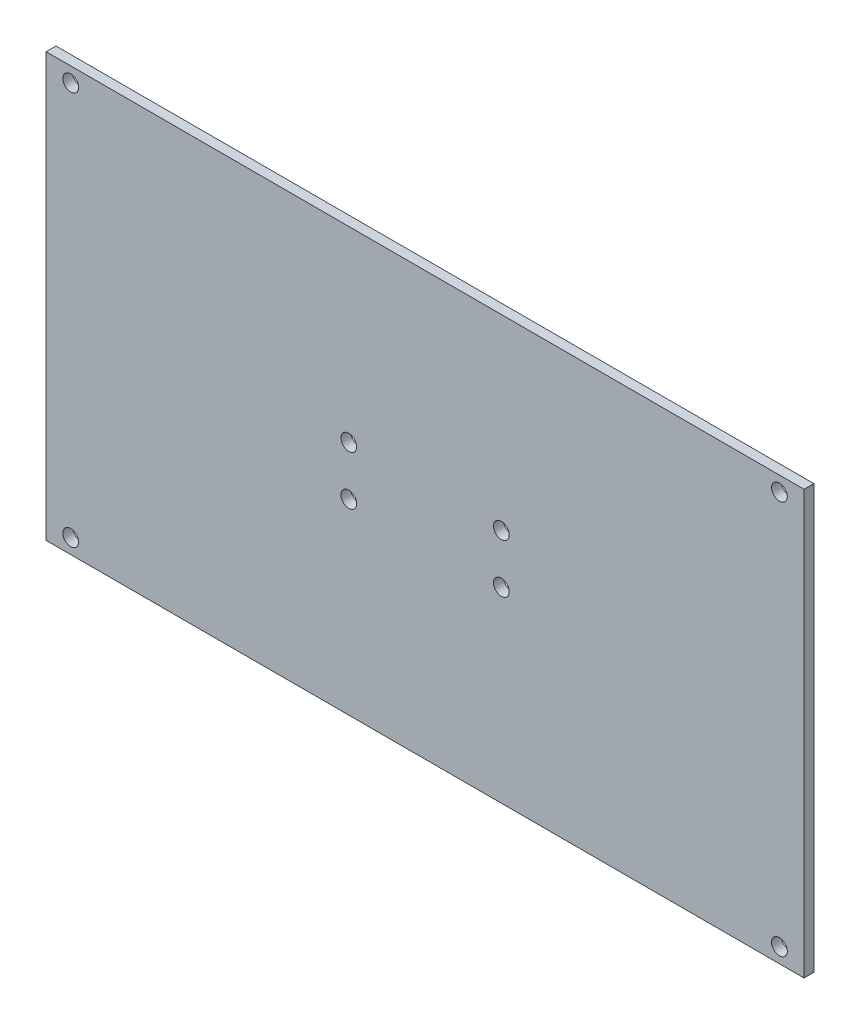
ISO-10303-21;
HEADER;
FILE_DESCRIPTION(('STEP AP214'),'2;1');
FILE_NAME('part.step','',(''),(''),'','','');
FILE_SCHEMA(('AUTOMOTIVE_DESIGN { 1 0 10303 214 1 1 1 1 }'));
ENDSEC;
DATA;
#1=APPLICATION_CONTEXT('core data for automotive mechanical design processes');
#2=APPLICATION_PROTOCOL_DEFINITION('international standard','automotive_design',2000,#1);
#3=PRODUCT_CONTEXT('',#1,'mechanical');
#4=PRODUCT('Part','Part','',(#3));
#5=PRODUCT_RELATED_PRODUCT_CATEGORY('part','',(#4));
#6=PRODUCT_DEFINITION_FORMATION('','',#4);
#7=PRODUCT_DEFINITION_CONTEXT('part definition',#1,'design');
#8=PRODUCT_DEFINITION('design','',#6,#7);
#9=PRODUCT_DEFINITION_SHAPE('','',#8);
#10=(LENGTH_UNIT() NAMED_UNIT(*) SI_UNIT(.MILLI.,.METRE.));
#11=(NAMED_UNIT(*) PLANE_ANGLE_UNIT() SI_UNIT($,.RADIAN.));
#12=(NAMED_UNIT(*) SI_UNIT($,.STERADIAN.) SOLID_ANGLE_UNIT());
#13=UNCERTAINTY_MEASURE_WITH_UNIT(LENGTH_MEASURE(1.E-05),#10,'distance_accuracy_value','');
#14=(GEOMETRIC_REPRESENTATION_CONTEXT(3) GLOBAL_UNCERTAINTY_ASSIGNED_CONTEXT((#13)) GLOBAL_UNIT_ASSIGNED_CONTEXT((#10,
#11,#12)) REPRESENTATION_CONTEXT('',''));
#15=CARTESIAN_POINT('',(0.,0.,0.));
#16=DIRECTION('',(0.,0.,1.));
#17=DIRECTION('',(1.,0.,0.));
#18=AXIS2_PLACEMENT_3D('',#15,#16,#17);
#19=CARTESIAN_POINT('',(0.,0.,2.));
#20=DIRECTION('',(0.,0.,1.));
#21=DIRECTION('',(1.,0.,0.));
#22=AXIS2_PLACEMENT_3D('',#19,#20,#21);
#23=PLANE('',#22);
#24=CARTESIAN_POINT('',(-98.5,38.,2.));
#25=DIRECTION('',(0.,0.,1.));
#26=DIRECTION('',(-1.,0.,0.));
#27=AXIS2_PLACEMENT_3D('',#24,#25,#26);
#28=CIRCLE('',#27,1.60000000000001);
#29=CARTESIAN_POINT('',(-100.1,38.,2.));
#30=VERTEX_POINT('',#29);
#31=EDGE_CURVE('E147',#30,#30,#28,.T.);
#32=ORIENTED_EDGE('',*,*,#31,.F.);
#33=EDGE_LOOP('',(#32));
#34=FACE_BOUND('',#33,.T.);
#35=CARTESIAN_POINT('',(-67.5,38.,2.));
#36=DIRECTION('',(0.,0.,1.));
#37=DIRECTION('',(1.,0.,0.));
#38=AXIS2_PLACEMENT_3D('',#35,#36,#37);
#39=CIRCLE('',#38,1.60000000000001);
#40=CARTESIAN_POINT('',(-65.9,38.,2.));
#41=VERTEX_POINT('',#40);
#42=EDGE_CURVE('E146',#41,#41,#39,.T.);
#43=ORIENTED_EDGE('',*,*,#42,.F.);
#44=EDGE_LOOP('',(#43));
#45=FACE_BOUND('',#44,.T.);
#46=CARTESIAN_POINT('',(-67.5,48.,2.));
#47=DIRECTION('',(0.,0.,1.));
#48=DIRECTION('',(-1.,0.,0.));
#49=AXIS2_PLACEMENT_3D('',#46,#47,#48);
#50=CIRCLE('',#49,1.60000000000001);
#51=CARTESIAN_POINT('',(-69.1,48.,2.));
#52=VERTEX_POINT('',#51);
#53=EDGE_CURVE('E153',#52,#52,#50,.T.);
#54=ORIENTED_EDGE('',*,*,#53,.F.);
#55=EDGE_LOOP('',(#54));
#56=FACE_BOUND('',#55,.T.);
#57=CARTESIAN_POINT('',(-98.5,48.,2.));
#58=DIRECTION('',(0.,0.,1.));
#59=DIRECTION('',(1.,0.,0.));
#60=AXIS2_PLACEMENT_3D('',#57,#58,#59);
#61=CIRCLE('',#60,1.60000000000001);
#62=CARTESIAN_POINT('',(-96.9,48.,2.));
#63=VERTEX_POINT('',#62);
#64=EDGE_CURVE('E139',#63,#63,#61,.T.);
#65=ORIENTED_EDGE('',*,*,#64,.F.);
#66=EDGE_LOOP('',(#65));
#67=FACE_BOUND('',#66,.T.);
#68=CARTESIAN_POINT('',(-11.,83.,2.));
#69=DIRECTION('',(0.,0.,1.));
#70=DIRECTION('',(1.,0.,0.));
#71=AXIS2_PLACEMENT_3D('',#68,#69,#70);
#72=CIRCLE('',#71,1.60000000000002);
#73=CARTESIAN_POINT('',(-9.39999999999998,83.,2.));
#74=VERTEX_POINT('',#73);
#75=EDGE_CURVE('E122',#74,#74,#72,.T.);
#76=ORIENTED_EDGE('',*,*,#75,.F.);
#77=EDGE_LOOP('',(#76));
#78=FACE_BOUND('',#77,.T.);
#79=CARTESIAN_POINT('',(-155.,3.,2.));
#80=DIRECTION('',(0.,0.,1.));
#81=DIRECTION('',(-1.,0.,0.));
#82=AXIS2_PLACEMENT_3D('',#79,#80,#81);
#83=CIRCLE('',#82,1.60000000000002);
#84=CARTESIAN_POINT('',(-156.6,3.,2.));
#85=VERTEX_POINT('',#84);
#86=EDGE_CURVE('E101',#85,#85,#83,.T.);
#87=ORIENTED_EDGE('',*,*,#86,.F.);
#88=EDGE_LOOP('',(#87));
#89=FACE_BOUND('',#88,.T.);
#90=DIRECTION('',(0.,-1.,0.));
#91=VECTOR('',#90,1.);
#92=CARTESIAN_POINT('',(-160.,86.,2.));
#93=LINE('',#92,#91);
#94=CARTESIAN_POINT('',(-160.,86.,2.));
#95=VERTEX_POINT('',#94);
#96=CARTESIAN_POINT('',(-160.,0.,2.));
#97=VERTEX_POINT('',#96);
#98=EDGE_CURVE('E86',#95,#97,#93,.T.);
#99=ORIENTED_EDGE('',*,*,#98,.T.);
#100=DIRECTION('',(1.,0.,0.));
#101=VECTOR('',#100,1.);
#102=CARTESIAN_POINT('',(-160.,0.,2.));
#103=LINE('',#102,#101);
#104=CARTESIAN_POINT('',(-5.99999999999999,0.,2.));
#105=VERTEX_POINT('',#104);
#106=EDGE_CURVE('E81',#97,#105,#103,.T.);
#107=ORIENTED_EDGE('',*,*,#106,.T.);
#108=DIRECTION('',(0.,1.,0.));
#109=VECTOR('',#108,1.);
#110=CARTESIAN_POINT('',(-6.00000000000001,86.,2.));
#111=LINE('',#110,#109);
#112=CARTESIAN_POINT('',(-6.00000000000001,86.,2.));
#113=VERTEX_POINT('',#112);
#114=EDGE_CURVE('E84',#105,#113,#111,.T.);
#115=ORIENTED_EDGE('',*,*,#114,.T.);
#116=DIRECTION('',(-1.,0.,0.));
#117=VECTOR('',#116,1.);
#118=CARTESIAN_POINT('',(-160.,86.,2.));
#119=LINE('',#118,#117);
#120=EDGE_CURVE('E51',#113,#95,#119,.T.);
#121=ORIENTED_EDGE('',*,*,#120,.T.);
#122=EDGE_LOOP('',(#99,#107,#115,#121));
#123=FACE_BOUND('',#122,.T.);
#124=CARTESIAN_POINT('',(-11.,3.,2.));
#125=DIRECTION('',(0.,0.,1.));
#126=DIRECTION('',(1.,0.,0.));
#127=AXIS2_PLACEMENT_3D('',#124,#125,#126);
#128=CIRCLE('',#127,1.6);
#129=CARTESIAN_POINT('',(-9.4,3.,2.));
#130=VERTEX_POINT('',#129);
#131=EDGE_CURVE('E116',#130,#130,#128,.T.);
#132=ORIENTED_EDGE('',*,*,#131,.F.);
#133=EDGE_LOOP('',(#132));
#134=FACE_BOUND('',#133,.T.);
#135=CARTESIAN_POINT('',(-155.,83.,2.));
#136=DIRECTION('',(0.,0.,1.));
#137=DIRECTION('',(1.,0.,0.));
#138=AXIS2_PLACEMENT_3D('',#135,#136,#137);
#139=CIRCLE('',#138,1.60000000000002);
#140=CARTESIAN_POINT('',(-153.4,83.,2.));
#141=VERTEX_POINT('',#140);
#142=EDGE_CURVE('E128',#141,#141,#139,.T.);
#143=ORIENTED_EDGE('',*,*,#142,.F.);
#144=EDGE_LOOP('',(#143));
#145=FACE_BOUND('',#144,.T.);
#146=ADVANCED_FACE('F34',(#34,#45,#56,#67,#78,#89,#123,#134,#145),#23,.T.);
#147=CARTESIAN_POINT('',(0.,0.,0.));
#148=DIRECTION('',(0.,0.,1.));
#149=DIRECTION('',(1.,0.,0.));
#150=AXIS2_PLACEMENT_3D('',#147,#148,#149);
#151=PLANE('',#150);
#152=CARTESIAN_POINT('',(-98.5,38.,0.));
#153=DIRECTION('',(0.,0.,1.));
#154=DIRECTION('',(1.,0.,0.));
#155=AXIS2_PLACEMENT_3D('',#152,#153,#154);
#156=CIRCLE('',#155,1.60000000000001);
#157=CARTESIAN_POINT('',(-96.9,38.,0.));
#158=VERTEX_POINT('',#157);
#159=EDGE_CURVE('E143',#158,#158,#156,.F.);
#160=ORIENTED_EDGE('',*,*,#159,.F.);
#161=EDGE_LOOP('',(#160));
#162=FACE_BOUND('',#161,.T.);
#163=CARTESIAN_POINT('',(-67.5,38.,0.));
#164=DIRECTION('',(0.,0.,1.));
#165=DIRECTION('',(1.,0.,0.));
#166=AXIS2_PLACEMENT_3D('',#163,#164,#165);
#167=CIRCLE('',#166,1.60000000000001);
#168=CARTESIAN_POINT('',(-65.9,38.,0.));
#169=VERTEX_POINT('',#168);
#170=EDGE_CURVE('E150',#169,#169,#167,.F.);
#171=ORIENTED_EDGE('',*,*,#170,.F.);
#172=EDGE_LOOP('',(#171));
#173=FACE_BOUND('',#172,.T.);
#174=CARTESIAN_POINT('',(-67.5,48.,0.));
#175=DIRECTION('',(0.,0.,1.));
#176=DIRECTION('',(1.,0.,0.));
#177=AXIS2_PLACEMENT_3D('',#174,#175,#176);
#178=CIRCLE('',#177,1.60000000000001);
#179=CARTESIAN_POINT('',(-65.9,48.,0.));
#180=VERTEX_POINT('',#179);
#181=EDGE_CURVE('E142',#180,#180,#178,.F.);
#182=ORIENTED_EDGE('',*,*,#181,.F.);
#183=EDGE_LOOP('',(#182));
#184=FACE_BOUND('',#183,.T.);
#185=CARTESIAN_POINT('',(-98.5,48.,0.));
#186=DIRECTION('',(0.,0.,1.));
#187=DIRECTION('',(1.,0.,0.));
#188=AXIS2_PLACEMENT_3D('',#185,#186,#187);
#189=CIRCLE('',#188,1.60000000000001);
#190=CARTESIAN_POINT('',(-96.9,48.,0.));
#191=VERTEX_POINT('',#190);
#192=EDGE_CURVE('E134',#191,#191,#189,.F.);
#193=ORIENTED_EDGE('',*,*,#192,.F.);
#194=EDGE_LOOP('',(#193));
#195=FACE_BOUND('',#194,.T.);
#196=DIRECTION('',(0.,-1.,0.));
#197=VECTOR('',#196,1.);
#198=CARTESIAN_POINT('',(-160.,86.,0.));
#199=LINE('',#198,#197);
#200=CARTESIAN_POINT('',(-160.,86.,0.));
#201=VERTEX_POINT('',#200);
#202=CARTESIAN_POINT('',(-160.,0.,0.));
#203=VERTEX_POINT('',#202);
#204=EDGE_CURVE('E98',#201,#203,#199,.T.);
#205=ORIENTED_EDGE('',*,*,#204,.F.);
#206=DIRECTION('',(-1.,0.,0.));
#207=VECTOR('',#206,1.);
#208=CARTESIAN_POINT('',(-160.,86.,0.));
#209=LINE('',#208,#207);
#210=CARTESIAN_POINT('',(-6.00000000000001,86.,0.));
#211=VERTEX_POINT('',#210);
#212=EDGE_CURVE('E74',#211,#201,#209,.T.);
#213=ORIENTED_EDGE('',*,*,#212,.F.);
#214=DIRECTION('',(0.,1.,0.));
#215=VECTOR('',#214,1.);
#216=CARTESIAN_POINT('',(-6.00000000000001,86.,0.));
#217=LINE('',#216,#215);
#218=CARTESIAN_POINT('',(-5.99999999999999,0.,0.));
#219=VERTEX_POINT('',#218);
#220=EDGE_CURVE('E68',#219,#211,#217,.T.);
#221=ORIENTED_EDGE('',*,*,#220,.F.);
#222=DIRECTION('',(1.,0.,0.));
#223=VECTOR('',#222,1.);
#224=CARTESIAN_POINT('',(-160.,0.,0.));
#225=LINE('',#224,#223);
#226=EDGE_CURVE('E90',#203,#219,#225,.T.);
#227=ORIENTED_EDGE('',*,*,#226,.F.);
#228=EDGE_LOOP('',(#205,#213,#221,#227));
#229=FACE_BOUND('',#228,.T.);
#230=CARTESIAN_POINT('',(-155.,3.,0.));
#231=DIRECTION('',(0.,0.,1.));
#232=DIRECTION('',(-1.,0.,0.));
#233=AXIS2_PLACEMENT_3D('',#230,#231,#232);
#234=CIRCLE('',#233,1.60000000000002);
#235=CARTESIAN_POINT('',(-156.6,3.,0.));
#236=VERTEX_POINT('',#235);
#237=EDGE_CURVE('E113',#236,#236,#234,.T.);
#238=ORIENTED_EDGE('',*,*,#237,.T.);
#239=EDGE_LOOP('',(#238));
#240=FACE_BOUND('',#239,.T.);
#241=CARTESIAN_POINT('',(-11.,3.,0.));
#242=DIRECTION('',(0.,0.,1.));
#243=DIRECTION('',(1.,0.,0.));
#244=AXIS2_PLACEMENT_3D('',#241,#242,#243);
#245=CIRCLE('',#244,1.6);
#246=CARTESIAN_POINT('',(-9.4,3.,0.));
#247=VERTEX_POINT('',#246);
#248=EDGE_CURVE('E119',#247,#247,#245,.T.);
#249=ORIENTED_EDGE('',*,*,#248,.T.);
#250=EDGE_LOOP('',(#249));
#251=FACE_BOUND('',#250,.T.);
#252=CARTESIAN_POINT('',(-11.,83.,0.));
#253=DIRECTION('',(0.,0.,1.));
#254=DIRECTION('',(1.,0.,0.));
#255=AXIS2_PLACEMENT_3D('',#252,#253,#254);
#256=CIRCLE('',#255,1.60000000000002);
#257=CARTESIAN_POINT('',(-9.39999999999998,83.,0.));
#258=VERTEX_POINT('',#257);
#259=EDGE_CURVE('E125',#258,#258,#256,.T.);
#260=ORIENTED_EDGE('',*,*,#259,.T.);
#261=EDGE_LOOP('',(#260));
#262=FACE_BOUND('',#261,.T.);
#263=CARTESIAN_POINT('',(-155.,83.,0.));
#264=DIRECTION('',(0.,0.,1.));
#265=DIRECTION('',(1.,0.,0.));
#266=AXIS2_PLACEMENT_3D('',#263,#264,#265);
#267=CIRCLE('',#266,1.60000000000002);
#268=CARTESIAN_POINT('',(-153.4,83.,0.));
#269=VERTEX_POINT('',#268);
#270=EDGE_CURVE('E131',#269,#269,#267,.T.);
#271=ORIENTED_EDGE('',*,*,#270,.T.);
#272=EDGE_LOOP('',(#271));
#273=FACE_BOUND('',#272,.T.);
#274=ADVANCED_FACE('F109',(#162,#173,#184,#195,#229,#240,#251,#262,#273),#151,.F.);
#275=CARTESIAN_POINT('',(-160.,86.,2.));
#276=DIRECTION('',(1.,0.,0.));
#277=DIRECTION('',(0.,0.,-1.));
#278=AXIS2_PLACEMENT_3D('',#275,#276,#277);
#279=PLANE('',#278);
#280=ORIENTED_EDGE('',*,*,#204,.T.);
#281=DIRECTION('',(0.,0.,-1.));
#282=VECTOR('',#281,1.);
#283=CARTESIAN_POINT('',(-160.,0.,2.));
#284=LINE('',#283,#282);
#285=EDGE_CURVE('E11',#97,#203,#284,.T.);
#286=ORIENTED_EDGE('',*,*,#285,.F.);
#287=ORIENTED_EDGE('',*,*,#98,.F.);
#288=DIRECTION('',(0.,0.,-1.));
#289=VECTOR('',#288,1.);
#290=CARTESIAN_POINT('',(-160.,86.,2.));
#291=LINE('',#290,#289);
#292=EDGE_CURVE('E94',#95,#201,#291,.T.);
#293=ORIENTED_EDGE('',*,*,#292,.T.);
#294=EDGE_LOOP('',(#280,#286,#287,#293));
#295=FACE_BOUND('',#294,.T.);
#296=ADVANCED_FACE('F36',(#295),#279,.F.);
#297=CARTESIAN_POINT('',(-160.,0.,2.));
#298=DIRECTION('',(0.,1.,0.));
#299=DIRECTION('',(0.,0.,1.));
#300=AXIS2_PLACEMENT_3D('',#297,#298,#299);
#301=PLANE('',#300);
#302=ORIENTED_EDGE('',*,*,#226,.T.);
#303=DIRECTION('',(0.,0.,-1.));
#304=VECTOR('',#303,1.);
#305=CARTESIAN_POINT('',(-5.99999999999999,0.,2.));
#306=LINE('',#305,#304);
#307=EDGE_CURVE('E43',#105,#219,#306,.T.);
#308=ORIENTED_EDGE('',*,*,#307,.F.);
#309=ORIENTED_EDGE('',*,*,#106,.F.);
#310=ORIENTED_EDGE('',*,*,#285,.T.);
#311=EDGE_LOOP('',(#302,#308,#309,#310));
#312=FACE_BOUND('',#311,.T.);
#313=ADVANCED_FACE('F89',(#312),#301,.F.);
#314=CARTESIAN_POINT('',(-6.00000000000001,86.,2.));
#315=DIRECTION('',(-1.,0.,0.));
#316=DIRECTION('',(0.,-1.,0.));
#317=AXIS2_PLACEMENT_3D('',#314,#315,#316);
#318=PLANE('',#317);
#319=ORIENTED_EDGE('',*,*,#220,.T.);
#320=DIRECTION('',(0.,0.,-1.));
#321=VECTOR('',#320,1.);
#322=CARTESIAN_POINT('',(-6.00000000000001,86.,2.));
#323=LINE('',#322,#321);
#324=EDGE_CURVE('E91',#113,#211,#323,.T.);
#325=ORIENTED_EDGE('',*,*,#324,.F.);
#326=ORIENTED_EDGE('',*,*,#114,.F.);
#327=ORIENTED_EDGE('',*,*,#307,.T.);
#328=EDGE_LOOP('',(#319,#325,#326,#327));
#329=FACE_BOUND('',#328,.T.);
#330=ADVANCED_FACE('F92',(#329),#318,.F.);
#331=CARTESIAN_POINT('',(-160.,86.,2.));
#332=DIRECTION('',(0.,-1.,0.));
#333=DIRECTION('',(0.,0.,-1.));
#334=AXIS2_PLACEMENT_3D('',#331,#332,#333);
#335=PLANE('',#334);
#336=ORIENTED_EDGE('',*,*,#212,.T.);
#337=ORIENTED_EDGE('',*,*,#292,.F.);
#338=ORIENTED_EDGE('',*,*,#120,.F.);
#339=ORIENTED_EDGE('',*,*,#324,.T.);
#340=EDGE_LOOP('',(#336,#337,#338,#339));
#341=FACE_BOUND('',#340,.T.);
#342=ADVANCED_FACE('F106',(#341),#335,.F.);
#343=CARTESIAN_POINT('',(-155.,3.,2.));
#344=DIRECTION('',(0.,0.,-1.));
#345=DIRECTION('',(-1.,0.,0.));
#346=AXIS2_PLACEMENT_3D('',#343,#344,#345);
#347=CYLINDRICAL_SURFACE('',#346,1.60000000000002);
#348=ORIENTED_EDGE('',*,*,#86,.T.);
#349=EDGE_LOOP('',(#348));
#350=FACE_BOUND('',#349,.T.);
#351=ORIENTED_EDGE('',*,*,#237,.F.);
#352=EDGE_LOOP('',(#351));
#353=FACE_BOUND('',#352,.T.);
#354=ADVANCED_FACE('F174',(#350,#353),#347,.F.);
#355=CARTESIAN_POINT('',(-11.,3.,2.));
#356=DIRECTION('',(0.,0.,-1.));
#357=DIRECTION('',(-1.,0.,0.));
#358=AXIS2_PLACEMENT_3D('',#355,#356,#357);
#359=CYLINDRICAL_SURFACE('',#358,1.6);
#360=ORIENTED_EDGE('',*,*,#131,.T.);
#361=EDGE_LOOP('',(#360));
#362=FACE_BOUND('',#361,.T.);
#363=ORIENTED_EDGE('',*,*,#248,.F.);
#364=EDGE_LOOP('',(#363));
#365=FACE_BOUND('',#364,.T.);
#366=ADVANCED_FACE('F177',(#362,#365),#359,.F.);
#367=CARTESIAN_POINT('',(-11.,83.,2.));
#368=DIRECTION('',(0.,0.,-1.));
#369=DIRECTION('',(-1.,0.,0.));
#370=AXIS2_PLACEMENT_3D('',#367,#368,#369);
#371=CYLINDRICAL_SURFACE('',#370,1.60000000000002);
#372=ORIENTED_EDGE('',*,*,#75,.T.);
#373=EDGE_LOOP('',(#372));
#374=FACE_BOUND('',#373,.T.);
#375=ORIENTED_EDGE('',*,*,#259,.F.);
#376=EDGE_LOOP('',(#375));
#377=FACE_BOUND('',#376,.T.);
#378=ADVANCED_FACE('F193',(#374,#377),#371,.F.);
#379=CARTESIAN_POINT('',(-155.,83.,2.));
#380=DIRECTION('',(0.,0.,-1.));
#381=DIRECTION('',(-1.,0.,0.));
#382=AXIS2_PLACEMENT_3D('',#379,#380,#381);
#383=CYLINDRICAL_SURFACE('',#382,1.60000000000002);
#384=ORIENTED_EDGE('',*,*,#142,.T.);
#385=EDGE_LOOP('',(#384));
#386=FACE_BOUND('',#385,.T.);
#387=ORIENTED_EDGE('',*,*,#270,.F.);
#388=EDGE_LOOP('',(#387));
#389=FACE_BOUND('',#388,.T.);
#390=ADVANCED_FACE('F190',(#386,#389),#383,.F.);
#391=CARTESIAN_POINT('',(-98.5,48.,-0.00100000000000013));
#392=DIRECTION('',(0.,0.,1.));
#393=DIRECTION('',(1.,0.,0.));
#394=AXIS2_PLACEMENT_3D('',#391,#392,#393);
#395=CYLINDRICAL_SURFACE('',#394,1.60000000000001);
#396=ORIENTED_EDGE('',*,*,#64,.T.);
#397=EDGE_LOOP('',(#396));
#398=FACE_BOUND('',#397,.T.);
#399=ORIENTED_EDGE('',*,*,#192,.T.);
#400=EDGE_LOOP('',(#399));
#401=FACE_BOUND('',#400,.T.);
#402=ADVANCED_FACE('F192',(#398,#401),#395,.F.);
#403=CARTESIAN_POINT('',(-67.5,48.,-0.00100000000000013));
#404=DIRECTION('',(0.,0.,1.));
#405=DIRECTION('',(1.,0.,0.));
#406=AXIS2_PLACEMENT_3D('',#403,#404,#405);
#407=CYLINDRICAL_SURFACE('',#406,1.60000000000001);
#408=ORIENTED_EDGE('',*,*,#53,.T.);
#409=EDGE_LOOP('',(#408));
#410=FACE_BOUND('',#409,.T.);
#411=ORIENTED_EDGE('',*,*,#181,.T.);
#412=EDGE_LOOP('',(#411));
#413=FACE_BOUND('',#412,.T.);
#414=ADVANCED_FACE('F161',(#410,#413),#407,.F.);
#415=CARTESIAN_POINT('',(-67.5,38.,-0.00100000000000013));
#416=DIRECTION('',(0.,0.,1.));
#417=DIRECTION('',(1.,0.,0.));
#418=AXIS2_PLACEMENT_3D('',#415,#416,#417);
#419=CYLINDRICAL_SURFACE('',#418,1.60000000000001);
#420=ORIENTED_EDGE('',*,*,#42,.T.);
#421=EDGE_LOOP('',(#420));
#422=FACE_BOUND('',#421,.T.);
#423=ORIENTED_EDGE('',*,*,#170,.T.);
#424=EDGE_LOOP('',(#423));
#425=FACE_BOUND('',#424,.T.);
#426=ADVANCED_FACE('F283',(#422,#425),#419,.F.);
#427=CARTESIAN_POINT('',(-98.5,38.,-0.00100000000000013));
#428=DIRECTION('',(0.,0.,1.));
#429=DIRECTION('',(1.,0.,0.));
#430=AXIS2_PLACEMENT_3D('',#427,#428,#429);
#431=CYLINDRICAL_SURFACE('',#430,1.60000000000001);
#432=ORIENTED_EDGE('',*,*,#31,.T.);
#433=EDGE_LOOP('',(#432));
#434=FACE_BOUND('',#433,.T.);
#435=ORIENTED_EDGE('',*,*,#159,.T.);
#436=EDGE_LOOP('',(#435));
#437=FACE_BOUND('',#436,.T.);
#438=ADVANCED_FACE('F291',(#434,#437),#431,.F.);
#439=CLOSED_SHELL('',(#146,#274,#296,#313,#330,#342,#354,#366,#378,#390,#402,#414,#426,#438));
#440=MANIFOLD_SOLID_BREP('B2',#439);
#441=ADVANCED_BREP_SHAPE_REPRESENTATION('',(#18,#440),#14);
#442=SHAPE_DEFINITION_REPRESENTATION(#9,#441);
ENDSEC;
END-ISO-10303-21;
